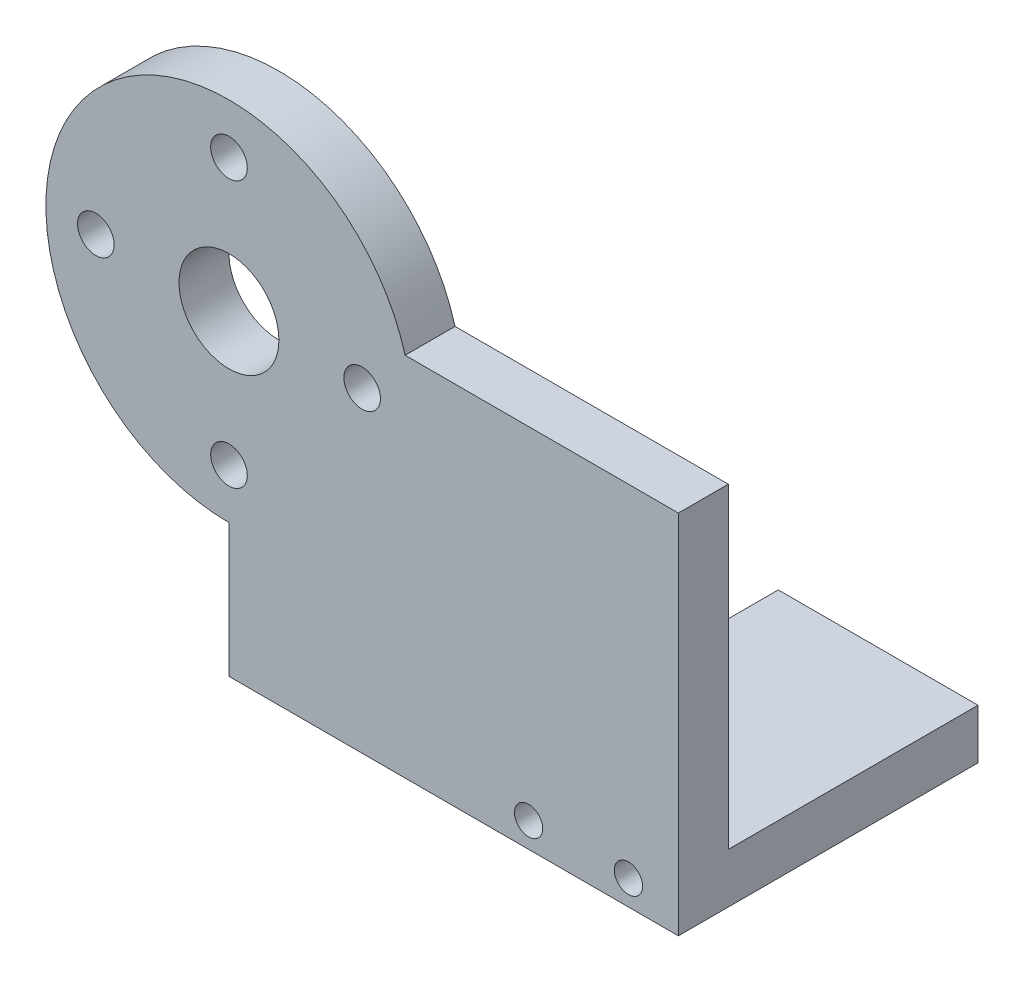
ISO-10303-21;
HEADER;
FILE_DESCRIPTION(('STEP AP214'),'2;1');
FILE_NAME('part.step','',(''),(''),'','','');
FILE_SCHEMA(('AUTOMOTIVE_DESIGN { 1 0 10303 214 1 1 1 1 }'));
ENDSEC;
DATA;
#1=APPLICATION_CONTEXT('core data for automotive mechanical design processes');
#2=APPLICATION_PROTOCOL_DEFINITION('international standard','automotive_design',2000,#1);
#3=PRODUCT_CONTEXT('',#1,'mechanical');
#4=PRODUCT('Part','Part','',(#3));
#5=PRODUCT_RELATED_PRODUCT_CATEGORY('part','',(#4));
#6=PRODUCT_DEFINITION_FORMATION('','',#4);
#7=PRODUCT_DEFINITION_CONTEXT('part definition',#1,'design');
#8=PRODUCT_DEFINITION('design','',#6,#7);
#9=PRODUCT_DEFINITION_SHAPE('','',#8);
#10=(LENGTH_UNIT() NAMED_UNIT(*) SI_UNIT(.MILLI.,.METRE.));
#11=(NAMED_UNIT(*) PLANE_ANGLE_UNIT() SI_UNIT($,.RADIAN.));
#12=(NAMED_UNIT(*) SI_UNIT($,.STERADIAN.) SOLID_ANGLE_UNIT());
#13=UNCERTAINTY_MEASURE_WITH_UNIT(LENGTH_MEASURE(1.E-05),#10,'distance_accuracy_value','');
#14=(GEOMETRIC_REPRESENTATION_CONTEXT(3) GLOBAL_UNCERTAINTY_ASSIGNED_CONTEXT((#13)) GLOBAL_UNIT_ASSIGNED_CONTEXT((#10,
#11,#12)) REPRESENTATION_CONTEXT('',''));
#15=CARTESIAN_POINT('',(0.,0.,0.));
#16=DIRECTION('',(0.,0.,1.));
#17=DIRECTION('',(1.,0.,0.));
#18=AXIS2_PLACEMENT_3D('',#15,#16,#17);
#19=CARTESIAN_POINT('',(0.,0.,15.));
#20=DIRECTION('',(0.,0.,1.));
#21=DIRECTION('',(1.,0.,0.));
#22=AXIS2_PLACEMENT_3D('',#19,#20,#21);
#23=PLANE('',#22);
#24=CARTESIAN_POINT('',(0.,-8.,15.));
#25=DIRECTION('',(0.,0.,1.));
#26=DIRECTION('',(1.,0.,0.));
#27=AXIS2_PLACEMENT_3D('',#24,#25,#26);
#28=CIRCLE('',#27,1.1);
#29=CARTESIAN_POINT('',(1.1,-8.,15.));
#30=VERTEX_POINT('',#29);
#31=EDGE_CURVE('E247',#30,#30,#28,.F.);
#32=ORIENTED_EDGE('',*,*,#31,.F.);
#33=EDGE_LOOP('',(#32));
#34=FACE_BOUND('',#33,.T.);
#35=CARTESIAN_POINT('',(0.,8.,15.));
#36=DIRECTION('',(0.,0.,1.));
#37=DIRECTION('',(1.,0.,0.));
#38=AXIS2_PLACEMENT_3D('',#35,#36,#37);
#39=CIRCLE('',#38,1.1);
#40=CARTESIAN_POINT('',(1.1,8.,15.));
#41=VERTEX_POINT('',#40);
#42=EDGE_CURVE('E249',#41,#41,#39,.F.);
#43=ORIENTED_EDGE('',*,*,#42,.F.);
#44=EDGE_LOOP('',(#43));
#45=FACE_BOUND('',#44,.T.);
#46=CARTESIAN_POINT('',(-8.,0.,15.));
#47=DIRECTION('',(0.,0.,1.));
#48=DIRECTION('',(1.,0.,0.));
#49=AXIS2_PLACEMENT_3D('',#46,#47,#48);
#50=CIRCLE('',#49,1.1);
#51=CARTESIAN_POINT('',(-6.9,0.,15.));
#52=VERTEX_POINT('',#51);
#53=EDGE_CURVE('E241',#52,#52,#50,.F.);
#54=ORIENTED_EDGE('',*,*,#53,.F.);
#55=EDGE_LOOP('',(#54));
#56=FACE_BOUND('',#55,.T.);
#57=CARTESIAN_POINT('',(8.,0.,15.));
#58=DIRECTION('',(0.,0.,1.));
#59=DIRECTION('',(1.,0.,0.));
#60=AXIS2_PLACEMENT_3D('',#57,#58,#59);
#61=CIRCLE('',#60,1.1);
#62=CARTESIAN_POINT('',(9.1,0.,15.));
#63=VERTEX_POINT('',#62);
#64=EDGE_CURVE('E226',#63,#63,#61,.F.);
#65=ORIENTED_EDGE('',*,*,#64,.F.);
#66=EDGE_LOOP('',(#65));
#67=FACE_BOUND('',#66,.T.);
#68=CARTESIAN_POINT('',(0.,0.,15.));
#69=DIRECTION('',(0.,0.,1.));
#70=DIRECTION('',(1.,0.,0.));
#71=AXIS2_PLACEMENT_3D('',#68,#69,#70);
#72=CIRCLE('',#71,3.);
#73=CARTESIAN_POINT('',(3.,0.,15.));
#74=VERTEX_POINT('',#73);
#75=EDGE_CURVE('E136',#74,#74,#72,.F.);
#76=ORIENTED_EDGE('',*,*,#75,.F.);
#77=EDGE_LOOP('',(#76));
#78=FACE_BOUND('',#77,.T.);
#79=DIRECTION('',(0.,1.,0.));
#80=VECTOR('',#79,1.);
#81=CARTESIAN_POINT('',(15.,0.,15.));
#82=LINE('',#81,#80);
#83=CARTESIAN_POINT('',(15.,-19.,15.));
#84=VERTEX_POINT('',#83);
#85=CARTESIAN_POINT('',(15.,-16.,15.));
#86=VERTEX_POINT('',#85);
#87=EDGE_CURVE('E11',#84,#86,#82,.T.);
#88=ORIENTED_EDGE('',*,*,#87,.F.);
#89=DIRECTION('',(1.,0.,0.));
#90=VECTOR('',#89,1.);
#91=CARTESIAN_POINT('',(0.,-19.,15.));
#92=LINE('',#91,#90);
#93=CARTESIAN_POINT('',(0.,-19.,15.));
#94=VERTEX_POINT('',#93);
#95=EDGE_CURVE('E119',#94,#84,#92,.T.);
#96=ORIENTED_EDGE('',*,*,#95,.F.);
#97=DIRECTION('',(0.,-1.,0.));
#98=VECTOR('',#97,1.);
#99=CARTESIAN_POINT('',(0.,-19.,15.));
#100=LINE('',#99,#98);
#101=CARTESIAN_POINT('',(0.,-11.,15.));
#102=VERTEX_POINT('',#101);
#103=EDGE_CURVE('E117',#102,#94,#100,.T.);
#104=ORIENTED_EDGE('',*,*,#103,.F.);
#105=CARTESIAN_POINT('',(0.,0.,15.));
#106=DIRECTION('',(0.,0.,1.));
#107=DIRECTION('',(1.,0.,0.));
#108=AXIS2_PLACEMENT_3D('',#105,#106,#107);
#109=CIRCLE('',#108,11.);
#110=CARTESIAN_POINT('',(10.5830052442584,3.,15.));
#111=VERTEX_POINT('',#110);
#112=EDGE_CURVE('E191',#111,#102,#109,.T.);
#113=ORIENTED_EDGE('',*,*,#112,.F.);
#114=DIRECTION('',(-1.,0.,0.));
#115=VECTOR('',#114,1.);
#116=CARTESIAN_POINT('',(0.,3.,15.));
#117=LINE('',#116,#115);
#118=CARTESIAN_POINT('',(27.,3.,15.));
#119=VERTEX_POINT('',#118);
#120=EDGE_CURVE('E158',#119,#111,#117,.T.);
#121=ORIENTED_EDGE('',*,*,#120,.F.);
#122=DIRECTION('',(0.,1.,0.));
#123=VECTOR('',#122,1.);
#124=CARTESIAN_POINT('',(27.,-19.,15.));
#125=LINE('',#124,#123);
#126=CARTESIAN_POINT('',(27.,-16.,15.));
#127=VERTEX_POINT('',#126);
#128=EDGE_CURVE('E175',#127,#119,#125,.T.);
#129=ORIENTED_EDGE('',*,*,#128,.F.);
#130=DIRECTION('',(1.,0.,0.));
#131=VECTOR('',#130,1.);
#132=CARTESIAN_POINT('',(0.,-16.,15.));
#133=LINE('',#132,#131);
#134=EDGE_CURVE('E54',#86,#127,#133,.T.);
#135=ORIENTED_EDGE('',*,*,#134,.F.);
#136=EDGE_LOOP('',(#88,#96,#104,#113,#121,#129,#135));
#137=FACE_BOUND('',#136,.T.);
#138=ADVANCED_FACE('F44',(#34,#45,#56,#67,#78,#137),#23,.F.);
#139=CARTESIAN_POINT('',(0.,0.,18.));
#140=DIRECTION('',(0.,0.,-1.));
#141=DIRECTION('',(-1.,0.,0.));
#142=AXIS2_PLACEMENT_3D('',#139,#140,#141);
#143=CYLINDRICAL_SURFACE('',#142,11.);
#144=DIRECTION('',(0.,0.,-1.));
#145=VECTOR('',#144,1.);
#146=CARTESIAN_POINT('',(0.,-11.,18.));
#147=LINE('',#146,#145);
#148=CARTESIAN_POINT('',(0.,-11.,18.));
#149=VERTEX_POINT('',#148);
#150=EDGE_CURVE('E197',#149,#102,#147,.T.);
#151=ORIENTED_EDGE('',*,*,#150,.F.);
#152=CARTESIAN_POINT('',(0.,0.,18.));
#153=DIRECTION('',(0.,0.,1.));
#154=DIRECTION('',(1.,0.,0.));
#155=AXIS2_PLACEMENT_3D('',#152,#153,#154);
#156=CIRCLE('',#155,11.);
#157=CARTESIAN_POINT('',(10.5830052442584,3.,18.));
#158=VERTEX_POINT('',#157);
#159=EDGE_CURVE('E195',#158,#149,#156,.T.);
#160=ORIENTED_EDGE('',*,*,#159,.F.);
#161=DIRECTION('',(0.,0.,-1.));
#162=VECTOR('',#161,1.);
#163=CARTESIAN_POINT('',(10.5830052442584,3.,18.));
#164=LINE('',#163,#162);
#165=EDGE_CURVE('E190',#111,#158,#164,.F.);
#166=ORIENTED_EDGE('',*,*,#165,.F.);
#167=ORIENTED_EDGE('',*,*,#112,.T.);
#168=EDGE_LOOP('',(#151,#160,#166,#167));
#169=FACE_BOUND('',#168,.T.);
#170=ADVANCED_FACE('F50',(#169),#143,.T.);
#171=CARTESIAN_POINT('',(0.,0.,18.));
#172=DIRECTION('',(0.,0.,1.));
#173=DIRECTION('',(1.,0.,0.));
#174=AXIS2_PLACEMENT_3D('',#171,#172,#173);
#175=PLANE('',#174);
#176=CARTESIAN_POINT('',(18.,-17.5,18.));
#177=DIRECTION('',(0.,0.,1.));
#178=DIRECTION('',(1.,0.,0.));
#179=AXIS2_PLACEMENT_3D('',#176,#177,#178);
#180=CIRCLE('',#179,0.85);
#181=CARTESIAN_POINT('',(18.85,-17.5,18.));
#182=VERTEX_POINT('',#181);
#183=EDGE_CURVE('E210',#182,#182,#180,.T.);
#184=ORIENTED_EDGE('',*,*,#183,.F.);
#185=EDGE_LOOP('',(#184));
#186=FACE_BOUND('',#185,.T.);
#187=CARTESIAN_POINT('',(24.,-17.5,18.));
#188=DIRECTION('',(0.,0.,1.));
#189=DIRECTION('',(1.,0.,0.));
#190=AXIS2_PLACEMENT_3D('',#187,#188,#189);
#191=CIRCLE('',#190,0.85);
#192=CARTESIAN_POINT('',(24.85,-17.5,18.));
#193=VERTEX_POINT('',#192);
#194=EDGE_CURVE('E214',#193,#193,#191,.T.);
#195=ORIENTED_EDGE('',*,*,#194,.F.);
#196=EDGE_LOOP('',(#195));
#197=FACE_BOUND('',#196,.T.);
#198=CARTESIAN_POINT('',(0.,-8.,18.));
#199=DIRECTION('',(0.,0.,1.));
#200=DIRECTION('',(1.,0.,0.));
#201=AXIS2_PLACEMENT_3D('',#198,#199,#200);
#202=CIRCLE('',#201,1.1);
#203=CARTESIAN_POINT('',(1.1,-8.,18.));
#204=VERTEX_POINT('',#203);
#205=EDGE_CURVE('E224',#204,#204,#202,.T.);
#206=ORIENTED_EDGE('',*,*,#205,.F.);
#207=EDGE_LOOP('',(#206));
#208=FACE_BOUND('',#207,.T.);
#209=CARTESIAN_POINT('',(0.,8.,18.));
#210=DIRECTION('',(0.,0.,1.));
#211=DIRECTION('',(1.,0.,0.));
#212=AXIS2_PLACEMENT_3D('',#209,#210,#211);
#213=CIRCLE('',#212,1.1);
#214=CARTESIAN_POINT('',(1.1,8.,18.));
#215=VERTEX_POINT('',#214);
#216=EDGE_CURVE('E230',#215,#215,#213,.T.);
#217=ORIENTED_EDGE('',*,*,#216,.F.);
#218=EDGE_LOOP('',(#217));
#219=FACE_BOUND('',#218,.T.);
#220=CARTESIAN_POINT('',(-8.,0.,18.));
#221=DIRECTION('',(0.,0.,1.));
#222=DIRECTION('',(1.,0.,0.));
#223=AXIS2_PLACEMENT_3D('',#220,#221,#222);
#224=CIRCLE('',#223,1.1);
#225=CARTESIAN_POINT('',(-6.9,0.,18.));
#226=VERTEX_POINT('',#225);
#227=EDGE_CURVE('E231',#226,#226,#224,.T.);
#228=ORIENTED_EDGE('',*,*,#227,.F.);
#229=EDGE_LOOP('',(#228));
#230=FACE_BOUND('',#229,.T.);
#231=CARTESIAN_POINT('',(8.,0.,18.));
#232=DIRECTION('',(0.,0.,1.));
#233=DIRECTION('',(1.,0.,0.));
#234=AXIS2_PLACEMENT_3D('',#231,#232,#233);
#235=CIRCLE('',#234,1.1);
#236=CARTESIAN_POINT('',(9.1,0.,18.));
#237=VERTEX_POINT('',#236);
#238=EDGE_CURVE('E213',#237,#237,#235,.T.);
#239=ORIENTED_EDGE('',*,*,#238,.F.);
#240=EDGE_LOOP('',(#239));
#241=FACE_BOUND('',#240,.T.);
#242=CARTESIAN_POINT('',(0.,0.,18.));
#243=DIRECTION('',(0.,0.,1.));
#244=DIRECTION('',(1.,0.,0.));
#245=AXIS2_PLACEMENT_3D('',#242,#243,#244);
#246=CIRCLE('',#245,3.);
#247=CARTESIAN_POINT('',(3.,0.,18.));
#248=VERTEX_POINT('',#247);
#249=EDGE_CURVE('E143',#248,#248,#246,.T.);
#250=ORIENTED_EDGE('',*,*,#249,.F.);
#251=EDGE_LOOP('',(#250));
#252=FACE_BOUND('',#251,.T.);
#253=DIRECTION('',(1.,0.,0.));
#254=VECTOR('',#253,1.);
#255=CARTESIAN_POINT('',(0.,-19.,18.));
#256=LINE('',#255,#254);
#257=CARTESIAN_POINT('',(0.,-19.,18.));
#258=VERTEX_POINT('',#257);
#259=CARTESIAN_POINT('',(27.,-19.,18.));
#260=VERTEX_POINT('',#259);
#261=EDGE_CURVE('E160',#258,#260,#256,.T.);
#262=ORIENTED_EDGE('',*,*,#261,.T.);
#263=DIRECTION('',(0.,1.,0.));
#264=VECTOR('',#263,1.);
#265=CARTESIAN_POINT('',(27.,-19.,18.));
#266=LINE('',#265,#264);
#267=CARTESIAN_POINT('',(27.,3.,18.));
#268=VERTEX_POINT('',#267);
#269=EDGE_CURVE('E161',#260,#268,#266,.T.);
#270=ORIENTED_EDGE('',*,*,#269,.T.);
#271=DIRECTION('',(-1.,0.,0.));
#272=VECTOR('',#271,1.);
#273=CARTESIAN_POINT('',(0.,3.,18.));
#274=LINE('',#273,#272);
#275=EDGE_CURVE('E163',#268,#158,#274,.T.);
#276=ORIENTED_EDGE('',*,*,#275,.T.);
#277=ORIENTED_EDGE('',*,*,#159,.T.);
#278=DIRECTION('',(0.,-1.,0.));
#279=VECTOR('',#278,1.);
#280=CARTESIAN_POINT('',(0.,-19.,18.));
#281=LINE('',#280,#279);
#282=EDGE_CURVE('E152',#149,#258,#281,.T.);
#283=ORIENTED_EDGE('',*,*,#282,.T.);
#284=EDGE_LOOP('',(#262,#270,#276,#277,#283));
#285=FACE_BOUND('',#284,.T.);
#286=ADVANCED_FACE('F257',(#186,#197,#208,#219,#230,#241,#252,#285),#175,.T.);
#287=CARTESIAN_POINT('',(0.,-19.,18.));
#288=DIRECTION('',(1.,0.,0.));
#289=DIRECTION('',(0.,0.,-1.));
#290=AXIS2_PLACEMENT_3D('',#287,#288,#289);
#291=PLANE('',#290);
#292=ORIENTED_EDGE('',*,*,#282,.F.);
#293=ORIENTED_EDGE('',*,*,#150,.T.);
#294=ORIENTED_EDGE('',*,*,#103,.T.);
#295=DIRECTION('',(0.,0.,-1.));
#296=VECTOR('',#295,1.);
#297=CARTESIAN_POINT('',(0.,-19.,18.));
#298=LINE('',#297,#296);
#299=EDGE_CURVE('E183',#258,#94,#298,.T.);
#300=ORIENTED_EDGE('',*,*,#299,.F.);
#301=EDGE_LOOP('',(#292,#293,#294,#300));
#302=FACE_BOUND('',#301,.T.);
#303=ADVANCED_FACE('F263',(#302),#291,.F.);
#304=CARTESIAN_POINT('',(0.,3.,18.));
#305=DIRECTION('',(0.,-1.,0.));
#306=DIRECTION('',(0.,0.,-1.));
#307=AXIS2_PLACEMENT_3D('',#304,#305,#306);
#308=PLANE('',#307);
#309=ORIENTED_EDGE('',*,*,#120,.T.);
#310=ORIENTED_EDGE('',*,*,#165,.T.);
#311=ORIENTED_EDGE('',*,*,#275,.F.);
#312=DIRECTION('',(0.,0.,-1.));
#313=VECTOR('',#312,1.);
#314=CARTESIAN_POINT('',(27.,3.,18.));
#315=LINE('',#314,#313);
#316=EDGE_CURVE('E169',#268,#119,#315,.T.);
#317=ORIENTED_EDGE('',*,*,#316,.T.);
#318=EDGE_LOOP('',(#309,#310,#311,#317));
#319=FACE_BOUND('',#318,.T.);
#320=ADVANCED_FACE('F280',(#319),#308,.F.);
#321=CARTESIAN_POINT('',(0.,-19.,18.));
#322=DIRECTION('',(0.,1.,0.));
#323=DIRECTION('',(0.,0.,1.));
#324=AXIS2_PLACEMENT_3D('',#321,#322,#323);
#325=PLANE('',#324);
#326=DIRECTION('',(0.,0.,-1.));
#327=VECTOR('',#326,1.);
#328=CARTESIAN_POINT('',(27.,-19.,18.));
#329=LINE('',#328,#327);
#330=CARTESIAN_POINT('',(27.,-19.,0.));
#331=VERTEX_POINT('',#330);
#332=EDGE_CURVE('E185',#260,#331,#329,.T.);
#333=ORIENTED_EDGE('',*,*,#332,.F.);
#334=ORIENTED_EDGE('',*,*,#261,.F.);
#335=ORIENTED_EDGE('',*,*,#299,.T.);
#336=ORIENTED_EDGE('',*,*,#95,.T.);
#337=DIRECTION('',(0.,0.,-1.));
#338=VECTOR('',#337,1.);
#339=CARTESIAN_POINT('',(15.,-19.,18.));
#340=LINE('',#339,#338);
#341=CARTESIAN_POINT('',(15.,-19.,0.));
#342=VERTEX_POINT('',#341);
#343=EDGE_CURVE('E108',#84,#342,#340,.T.);
#344=ORIENTED_EDGE('',*,*,#343,.T.);
#345=DIRECTION('',(1.,0.,0.));
#346=VECTOR('',#345,1.);
#347=CARTESIAN_POINT('',(15.,-19.,0.));
#348=LINE('',#347,#346);
#349=EDGE_CURVE('E114',#342,#331,#348,.T.);
#350=ORIENTED_EDGE('',*,*,#349,.T.);
#351=EDGE_LOOP('',(#333,#334,#335,#336,#344,#350));
#352=FACE_BOUND('',#351,.T.);
#353=ADVANCED_FACE('F115',(#352),#325,.F.);
#354=CARTESIAN_POINT('',(27.,-19.,18.));
#355=DIRECTION('',(-1.,0.,0.));
#356=DIRECTION('',(0.,0.,1.));
#357=AXIS2_PLACEMENT_3D('',#354,#355,#356);
#358=PLANE('',#357);
#359=ORIENTED_EDGE('',*,*,#316,.F.);
#360=ORIENTED_EDGE('',*,*,#269,.F.);
#361=ORIENTED_EDGE('',*,*,#332,.T.);
#362=DIRECTION('',(0.,1.,0.));
#363=VECTOR('',#362,1.);
#364=CARTESIAN_POINT('',(27.,-19.,0.));
#365=LINE('',#364,#363);
#366=CARTESIAN_POINT('',(27.,-16.,0.));
#367=VERTEX_POINT('',#366);
#368=EDGE_CURVE('E129',#331,#367,#365,.T.);
#369=ORIENTED_EDGE('',*,*,#368,.T.);
#370=DIRECTION('',(0.,0.,-1.));
#371=VECTOR('',#370,1.);
#372=CARTESIAN_POINT('',(27.,-16.,18.));
#373=LINE('',#372,#371);
#374=EDGE_CURVE('E124',#127,#367,#373,.T.);
#375=ORIENTED_EDGE('',*,*,#374,.F.);
#376=ORIENTED_EDGE('',*,*,#128,.T.);
#377=EDGE_LOOP('',(#359,#360,#361,#369,#375,#376));
#378=FACE_BOUND('',#377,.T.);
#379=ADVANCED_FACE('F275',(#378),#358,.F.);
#380=CARTESIAN_POINT('',(15.,-19.,18.));
#381=DIRECTION('',(1.,0.,0.));
#382=DIRECTION('',(0.,0.,-1.));
#383=AXIS2_PLACEMENT_3D('',#380,#381,#382);
#384=PLANE('',#383);
#385=ORIENTED_EDGE('',*,*,#343,.F.);
#386=ORIENTED_EDGE('',*,*,#87,.T.);
#387=DIRECTION('',(0.,0.,-1.));
#388=VECTOR('',#387,1.);
#389=CARTESIAN_POINT('',(15.,-16.,18.));
#390=LINE('',#389,#388);
#391=CARTESIAN_POINT('',(15.,-16.,0.));
#392=VERTEX_POINT('',#391);
#393=EDGE_CURVE('E133',#86,#392,#390,.T.);
#394=ORIENTED_EDGE('',*,*,#393,.T.);
#395=DIRECTION('',(0.,-1.,0.));
#396=VECTOR('',#395,1.);
#397=CARTESIAN_POINT('',(15.,-19.,0.));
#398=LINE('',#397,#396);
#399=EDGE_CURVE('E130',#392,#342,#398,.T.);
#400=ORIENTED_EDGE('',*,*,#399,.T.);
#401=EDGE_LOOP('',(#385,#386,#394,#400));
#402=FACE_BOUND('',#401,.T.);
#403=ADVANCED_FACE('F131',(#402),#384,.F.);
#404=CARTESIAN_POINT('',(15.,-16.,18.));
#405=DIRECTION('',(0.,-1.,0.));
#406=DIRECTION('',(0.,0.,-1.));
#407=AXIS2_PLACEMENT_3D('',#404,#405,#406);
#408=PLANE('',#407);
#409=ORIENTED_EDGE('',*,*,#393,.F.);
#410=ORIENTED_EDGE('',*,*,#134,.T.);
#411=ORIENTED_EDGE('',*,*,#374,.T.);
#412=DIRECTION('',(-1.,0.,0.));
#413=VECTOR('',#412,1.);
#414=CARTESIAN_POINT('',(15.,-16.,0.));
#415=LINE('',#414,#413);
#416=EDGE_CURVE('E150',#367,#392,#415,.T.);
#417=ORIENTED_EDGE('',*,*,#416,.T.);
#418=EDGE_LOOP('',(#409,#410,#411,#417));
#419=FACE_BOUND('',#418,.T.);
#420=ADVANCED_FACE('F301',(#419),#408,.F.);
#421=CARTESIAN_POINT('',(0.,0.,0.));
#422=DIRECTION('',(0.,0.,-1.));
#423=DIRECTION('',(-1.,0.,0.));
#424=AXIS2_PLACEMENT_3D('',#421,#422,#423);
#425=PLANE('',#424);
#426=CARTESIAN_POINT('',(18.,-17.5,0.));
#427=DIRECTION('',(0.,0.,-1.));
#428=DIRECTION('',(-1.,0.,0.));
#429=AXIS2_PLACEMENT_3D('',#426,#427,#428);
#430=CIRCLE('',#429,0.85);
#431=CARTESIAN_POINT('',(17.15,-17.5,0.));
#432=VERTEX_POINT('',#431);
#433=EDGE_CURVE('E47',#432,#432,#430,.F.);
#434=ORIENTED_EDGE('',*,*,#433,.T.);
#435=EDGE_LOOP('',(#434));
#436=FACE_BOUND('',#435,.T.);
#437=CARTESIAN_POINT('',(24.,-17.5,0.));
#438=DIRECTION('',(0.,0.,-1.));
#439=DIRECTION('',(-1.,0.,0.));
#440=AXIS2_PLACEMENT_3D('',#437,#438,#439);
#441=CIRCLE('',#440,0.85);
#442=CARTESIAN_POINT('',(23.15,-17.5,0.));
#443=VERTEX_POINT('',#442);
#444=EDGE_CURVE('E204',#443,#443,#441,.F.);
#445=ORIENTED_EDGE('',*,*,#444,.T.);
#446=EDGE_LOOP('',(#445));
#447=FACE_BOUND('',#446,.T.);
#448=ORIENTED_EDGE('',*,*,#399,.F.);
#449=ORIENTED_EDGE('',*,*,#416,.F.);
#450=ORIENTED_EDGE('',*,*,#368,.F.);
#451=ORIENTED_EDGE('',*,*,#349,.F.);
#452=EDGE_LOOP('',(#448,#449,#450,#451));
#453=FACE_BOUND('',#452,.T.);
#454=ADVANCED_FACE('F122',(#436,#447,#453),#425,.T.);
#455=CARTESIAN_POINT('',(0.,0.,18.));
#456=DIRECTION('',(0.,0.,-1.));
#457=DIRECTION('',(-1.,0.,0.));
#458=AXIS2_PLACEMENT_3D('',#455,#456,#457);
#459=CYLINDRICAL_SURFACE('',#458,3.);
#460=ORIENTED_EDGE('',*,*,#249,.T.);
#461=EDGE_LOOP('',(#460));
#462=FACE_BOUND('',#461,.T.);
#463=ORIENTED_EDGE('',*,*,#75,.T.);
#464=EDGE_LOOP('',(#463));
#465=FACE_BOUND('',#464,.T.);
#466=ADVANCED_FACE('F260',(#462,#465),#459,.F.);
#467=CARTESIAN_POINT('',(8.,0.,18.));
#468=DIRECTION('',(0.,0.,-1.));
#469=DIRECTION('',(-1.,0.,0.));
#470=AXIS2_PLACEMENT_3D('',#467,#468,#469);
#471=CYLINDRICAL_SURFACE('',#470,1.1);
#472=ORIENTED_EDGE('',*,*,#238,.T.);
#473=EDGE_LOOP('',(#472));
#474=FACE_BOUND('',#473,.T.);
#475=ORIENTED_EDGE('',*,*,#64,.T.);
#476=EDGE_LOOP('',(#475));
#477=FACE_BOUND('',#476,.T.);
#478=ADVANCED_FACE('F309',(#474,#477),#471,.F.);
#479=CARTESIAN_POINT('',(-8.,0.,18.));
#480=DIRECTION('',(0.,0.,-1.));
#481=DIRECTION('',(-1.,0.,0.));
#482=AXIS2_PLACEMENT_3D('',#479,#480,#481);
#483=CYLINDRICAL_SURFACE('',#482,1.1);
#484=ORIENTED_EDGE('',*,*,#227,.T.);
#485=EDGE_LOOP('',(#484));
#486=FACE_BOUND('',#485,.T.);
#487=ORIENTED_EDGE('',*,*,#53,.T.);
#488=EDGE_LOOP('',(#487));
#489=FACE_BOUND('',#488,.T.);
#490=ADVANCED_FACE('F315',(#486,#489),#483,.F.);
#491=CARTESIAN_POINT('',(0.,8.,18.));
#492=DIRECTION('',(0.,0.,-1.));
#493=DIRECTION('',(-1.,0.,0.));
#494=AXIS2_PLACEMENT_3D('',#491,#492,#493);
#495=CYLINDRICAL_SURFACE('',#494,1.1);
#496=ORIENTED_EDGE('',*,*,#216,.T.);
#497=EDGE_LOOP('',(#496));
#498=FACE_BOUND('',#497,.T.);
#499=ORIENTED_EDGE('',*,*,#42,.T.);
#500=EDGE_LOOP('',(#499));
#501=FACE_BOUND('',#500,.T.);
#502=ADVANCED_FACE('F316',(#498,#501),#495,.F.);
#503=CARTESIAN_POINT('',(0.,-8.,18.));
#504=DIRECTION('',(0.,0.,-1.));
#505=DIRECTION('',(-1.,0.,0.));
#506=AXIS2_PLACEMENT_3D('',#503,#504,#505);
#507=CYLINDRICAL_SURFACE('',#506,1.1);
#508=ORIENTED_EDGE('',*,*,#205,.T.);
#509=EDGE_LOOP('',(#508));
#510=FACE_BOUND('',#509,.T.);
#511=ORIENTED_EDGE('',*,*,#31,.T.);
#512=EDGE_LOOP('',(#511));
#513=FACE_BOUND('',#512,.T.);
#514=ADVANCED_FACE('F319',(#510,#513),#507,.F.);
#515=CARTESIAN_POINT('',(24.,-17.5,18.));
#516=DIRECTION('',(0.,0.,-1.));
#517=DIRECTION('',(-1.,0.,0.));
#518=AXIS2_PLACEMENT_3D('',#515,#516,#517);
#519=CYLINDRICAL_SURFACE('',#518,0.85);
#520=ORIENTED_EDGE('',*,*,#444,.F.);
#521=EDGE_LOOP('',(#520));
#522=FACE_BOUND('',#521,.T.);
#523=ORIENTED_EDGE('',*,*,#194,.T.);
#524=EDGE_LOOP('',(#523));
#525=FACE_BOUND('',#524,.T.);
#526=ADVANCED_FACE('F322',(#522,#525),#519,.F.);
#527=CARTESIAN_POINT('',(18.,-17.5,18.));
#528=DIRECTION('',(0.,0.,-1.));
#529=DIRECTION('',(-1.,0.,0.));
#530=AXIS2_PLACEMENT_3D('',#527,#528,#529);
#531=CYLINDRICAL_SURFACE('',#530,0.85);
#532=ORIENTED_EDGE('',*,*,#433,.F.);
#533=EDGE_LOOP('',(#532));
#534=FACE_BOUND('',#533,.T.);
#535=ORIENTED_EDGE('',*,*,#183,.T.);
#536=EDGE_LOOP('',(#535));
#537=FACE_BOUND('',#536,.T.);
#538=ADVANCED_FACE('F327',(#534,#537),#531,.F.);
#539=CLOSED_SHELL('',(#138,#170,#286,#303,#320,#353,#379,#403,#420,#454,#466,#478,#490,#502,
#514,#526,#538));
#540=MANIFOLD_SOLID_BREP('B2',#539);
#541=ADVANCED_BREP_SHAPE_REPRESENTATION('',(#18,#540),#14);
#542=SHAPE_DEFINITION_REPRESENTATION(#9,#541);
ENDSEC;
END-ISO-10303-21;
